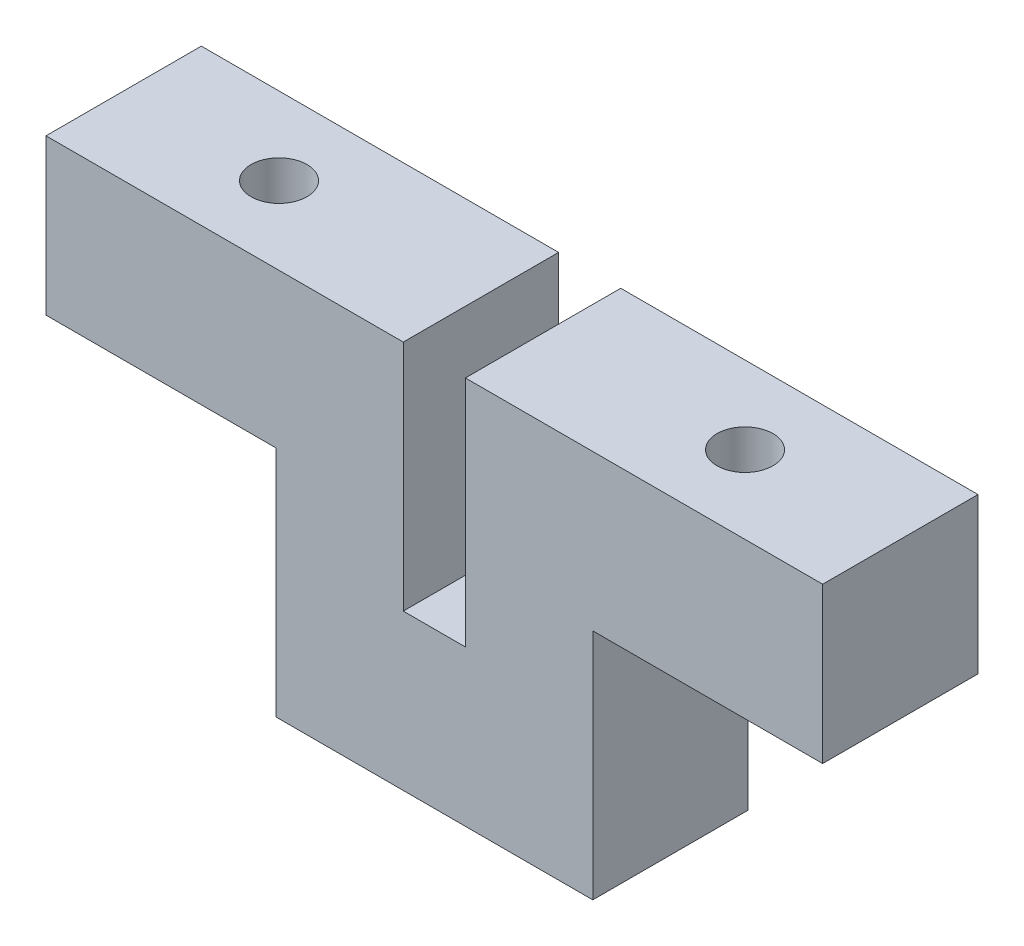
ISO-10303-21;
HEADER;
FILE_DESCRIPTION(('STEP AP214'),'2;1');
FILE_NAME('part.step','',(''),(''),'','','');
FILE_SCHEMA(('AUTOMOTIVE_DESIGN { 1 0 10303 214 1 1 1 1 }'));
ENDSEC;
DATA;
#1=APPLICATION_CONTEXT('core data for automotive mechanical design processes');
#2=APPLICATION_PROTOCOL_DEFINITION('international standard','automotive_design',2000,#1);
#3=PRODUCT_CONTEXT('',#1,'mechanical');
#4=PRODUCT('Part','Part','',(#3));
#5=PRODUCT_RELATED_PRODUCT_CATEGORY('part','',(#4));
#6=PRODUCT_DEFINITION_FORMATION('','',#4);
#7=PRODUCT_DEFINITION_CONTEXT('part definition',#1,'design');
#8=PRODUCT_DEFINITION('design','',#6,#7);
#9=PRODUCT_DEFINITION_SHAPE('','',#8);
#10=(LENGTH_UNIT() NAMED_UNIT(*) SI_UNIT(.MILLI.,.METRE.));
#11=(NAMED_UNIT(*) PLANE_ANGLE_UNIT() SI_UNIT($,.RADIAN.));
#12=(NAMED_UNIT(*) SI_UNIT($,.STERADIAN.) SOLID_ANGLE_UNIT());
#13=UNCERTAINTY_MEASURE_WITH_UNIT(LENGTH_MEASURE(1.E-05),#10,'distance_accuracy_value','');
#14=(GEOMETRIC_REPRESENTATION_CONTEXT(3) GLOBAL_UNCERTAINTY_ASSIGNED_CONTEXT((#13)) GLOBAL_UNIT_ASSIGNED_CONTEXT((#10,
#11,#12)) REPRESENTATION_CONTEXT('',''));
#15=CARTESIAN_POINT('',(0.,0.,0.));
#16=DIRECTION('',(0.,0.,1.));
#17=DIRECTION('',(1.,0.,0.));
#18=AXIS2_PLACEMENT_3D('',#15,#16,#17);
#19=CARTESIAN_POINT('',(0.,25.,10.));
#20=DIRECTION('',(0.,-1.,0.));
#21=DIRECTION('',(1.,0.,0.));
#22=AXIS2_PLACEMENT_3D('',#19,#20,#21);
#23=PLANE('',#22);
#24=CARTESIAN_POINT('',(10.,25.,5.));
#25=DIRECTION('',(0.,1.,0.));
#26=DIRECTION('',(-1.,0.,0.));
#27=AXIS2_PLACEMENT_3D('',#24,#25,#26);
#28=CIRCLE('',#27,1.8);
#29=CARTESIAN_POINT('',(8.2,25.,5.));
#30=VERTEX_POINT('',#29);
#31=EDGE_CURVE('E145',#30,#30,#28,.T.);
#32=ORIENTED_EDGE('',*,*,#31,.F.);
#33=EDGE_LOOP('',(#32));
#34=FACE_BOUND('',#33,.T.);
#35=DIRECTION('',(-1.,0.,0.));
#36=VECTOR('',#35,1.);
#37=CARTESIAN_POINT('',(0.,25.,10.));
#38=LINE('',#37,#36);
#39=CARTESIAN_POINT('',(23.,25.,10.));
#40=VERTEX_POINT('',#39);
#41=CARTESIAN_POINT('',(0.,25.,10.));
#42=VERTEX_POINT('',#41);
#43=EDGE_CURVE('E211',#40,#42,#38,.T.);
#44=ORIENTED_EDGE('',*,*,#43,.F.);
#45=DIRECTION('',(0.,0.,1.));
#46=VECTOR('',#45,1.);
#47=CARTESIAN_POINT('',(23.,25.,0.));
#48=LINE('',#47,#46);
#49=CARTESIAN_POINT('',(23.,25.,0.));
#50=VERTEX_POINT('',#49);
#51=EDGE_CURVE('E199',#50,#40,#48,.T.);
#52=ORIENTED_EDGE('',*,*,#51,.F.);
#53=DIRECTION('',(-1.,0.,0.));
#54=VECTOR('',#53,1.);
#55=CARTESIAN_POINT('',(0.,25.,0.));
#56=LINE('',#55,#54);
#57=CARTESIAN_POINT('',(0.,25.,0.));
#58=VERTEX_POINT('',#57);
#59=EDGE_CURVE('E147',#50,#58,#56,.T.);
#60=ORIENTED_EDGE('',*,*,#59,.T.);
#61=DIRECTION('',(0.,0.,-1.));
#62=VECTOR('',#61,1.);
#63=CARTESIAN_POINT('',(0.,25.,10.));
#64=LINE('',#63,#62);
#65=EDGE_CURVE('E42',#42,#58,#64,.T.);
#66=ORIENTED_EDGE('',*,*,#65,.F.);
#67=EDGE_LOOP('',(#44,#52,#60,#66));
#68=FACE_BOUND('',#67,.T.);
#69=ADVANCED_FACE('F33',(#34,#68),#23,.F.);
#70=CARTESIAN_POINT('',(50.,0.,10.));
#71=DIRECTION('',(0.,1.,0.));
#72=DIRECTION('',(-1.,0.,0.));
#73=AXIS2_PLACEMENT_3D('',#70,#71,#72);
#74=PLANE('',#73);
#75=DIRECTION('',(1.,0.,0.));
#76=VECTOR('',#75,1.);
#77=CARTESIAN_POINT('',(50.,0.,0.));
#78=LINE('',#77,#76);
#79=CARTESIAN_POINT('',(14.8,0.,0.));
#80=VERTEX_POINT('',#79);
#81=CARTESIAN_POINT('',(35.2,0.,0.));
#82=VERTEX_POINT('',#81);
#83=EDGE_CURVE('E138',#80,#82,#78,.T.);
#84=ORIENTED_EDGE('',*,*,#83,.T.);
#85=DIRECTION('',(0.,0.,1.));
#86=VECTOR('',#85,1.);
#87=CARTESIAN_POINT('',(35.2,0.,0.));
#88=LINE('',#87,#86);
#89=CARTESIAN_POINT('',(35.2,0.,10.));
#90=VERTEX_POINT('',#89);
#91=EDGE_CURVE('E122',#82,#90,#88,.T.);
#92=ORIENTED_EDGE('',*,*,#91,.T.);
#93=DIRECTION('',(1.,0.,0.));
#94=VECTOR('',#93,1.);
#95=CARTESIAN_POINT('',(50.,0.,10.));
#96=LINE('',#95,#94);
#97=CARTESIAN_POINT('',(14.8,0.,10.));
#98=VERTEX_POINT('',#97);
#99=EDGE_CURVE('E162',#98,#90,#96,.T.);
#100=ORIENTED_EDGE('',*,*,#99,.F.);
#101=DIRECTION('',(0.,0.,1.));
#102=VECTOR('',#101,1.);
#103=CARTESIAN_POINT('',(14.8,0.,0.));
#104=LINE('',#103,#102);
#105=EDGE_CURVE('E143',#80,#98,#104,.T.);
#106=ORIENTED_EDGE('',*,*,#105,.F.);
#107=EDGE_LOOP('',(#84,#92,#100,#106));
#108=FACE_BOUND('',#107,.T.);
#109=ADVANCED_FACE('F35',(#108),#74,.F.);
#110=CARTESIAN_POINT('',(50.,25.,10.));
#111=DIRECTION('',(-1.,0.,0.));
#112=DIRECTION('',(0.,0.,1.));
#113=AXIS2_PLACEMENT_3D('',#110,#111,#112);
#114=PLANE('',#113);
#115=DIRECTION('',(0.,1.,0.));
#116=VECTOR('',#115,1.);
#117=CARTESIAN_POINT('',(50.,25.,10.));
#118=LINE('',#117,#116);
#119=CARTESIAN_POINT('',(50.,15.,10.));
#120=VERTEX_POINT('',#119);
#121=CARTESIAN_POINT('',(50.,25.,10.));
#122=VERTEX_POINT('',#121);
#123=EDGE_CURVE('E210',#120,#122,#118,.T.);
#124=ORIENTED_EDGE('',*,*,#123,.F.);
#125=DIRECTION('',(0.,0.,1.));
#126=VECTOR('',#125,1.);
#127=CARTESIAN_POINT('',(50.,15.,0.));
#128=LINE('',#127,#126);
#129=CARTESIAN_POINT('',(50.,15.,0.));
#130=VERTEX_POINT('',#129);
#131=EDGE_CURVE('E130',#130,#120,#128,.T.);
#132=ORIENTED_EDGE('',*,*,#131,.F.);
#133=DIRECTION('',(0.,1.,0.));
#134=VECTOR('',#133,1.);
#135=CARTESIAN_POINT('',(50.,25.,0.));
#136=LINE('',#135,#134);
#137=CARTESIAN_POINT('',(50.,25.,0.));
#138=VERTEX_POINT('',#137);
#139=EDGE_CURVE('E144',#130,#138,#136,.T.);
#140=ORIENTED_EDGE('',*,*,#139,.T.);
#141=DIRECTION('',(0.,0.,-1.));
#142=VECTOR('',#141,1.);
#143=CARTESIAN_POINT('',(50.,25.,10.));
#144=LINE('',#143,#142);
#145=EDGE_CURVE('E11',#122,#138,#144,.T.);
#146=ORIENTED_EDGE('',*,*,#145,.F.);
#147=EDGE_LOOP('',(#124,#132,#140,#146));
#148=FACE_BOUND('',#147,.T.);
#149=ADVANCED_FACE('F236',(#148),#114,.F.);
#150=CARTESIAN_POINT('',(40.,25.,5.));
#151=DIRECTION('',(0.,1.,0.));
#152=DIRECTION('',(-1.,0.,0.));
#153=AXIS2_PLACEMENT_3D('',#150,#151,#152);
#154=CIRCLE('',#153,1.79999999999999);
#155=CARTESIAN_POINT('',(38.2,25.,5.));
#156=VERTEX_POINT('',#155);
#157=EDGE_CURVE('E150',#156,#156,#154,.T.);
#158=ORIENTED_EDGE('',*,*,#157,.F.);
#159=EDGE_LOOP('',(#158));
#160=FACE_BOUND('',#159,.T.);
#161=CARTESIAN_POINT('',(27.,25.,0.));
#162=VERTEX_POINT('',#161);
#163=EDGE_CURVE('E156',#138,#162,#56,.T.);
#164=ORIENTED_EDGE('',*,*,#163,.T.);
#165=DIRECTION('',(0.,0.,1.));
#166=VECTOR('',#165,1.);
#167=CARTESIAN_POINT('',(27.,25.,0.));
#168=LINE('',#167,#166);
#169=CARTESIAN_POINT('',(27.,25.,10.));
#170=VERTEX_POINT('',#169);
#171=EDGE_CURVE('E201',#162,#170,#168,.T.);
#172=ORIENTED_EDGE('',*,*,#171,.T.);
#173=EDGE_CURVE('E212',#122,#170,#38,.T.);
#174=ORIENTED_EDGE('',*,*,#173,.F.);
#175=ORIENTED_EDGE('',*,*,#145,.T.);
#176=EDGE_LOOP('',(#164,#172,#174,#175));
#177=FACE_BOUND('',#176,.T.);
#178=ADVANCED_FACE('F229',(#160,#177),#23,.F.);
#179=CARTESIAN_POINT('',(0.,0.,10.));
#180=DIRECTION('',(1.,0.,0.));
#181=DIRECTION('',(0.,1.,0.));
#182=AXIS2_PLACEMENT_3D('',#179,#180,#181);
#183=PLANE('',#182);
#184=DIRECTION('',(0.,-1.,0.));
#185=VECTOR('',#184,1.);
#186=CARTESIAN_POINT('',(0.,0.,0.));
#187=LINE('',#186,#185);
#188=CARTESIAN_POINT('',(0.,15.,0.));
#189=VERTEX_POINT('',#188);
#190=EDGE_CURVE('E159',#58,#189,#187,.T.);
#191=ORIENTED_EDGE('',*,*,#190,.T.);
#192=DIRECTION('',(0.,0.,1.));
#193=VECTOR('',#192,1.);
#194=CARTESIAN_POINT('',(0.,15.,0.));
#195=LINE('',#194,#193);
#196=CARTESIAN_POINT('',(0.,15.,10.));
#197=VERTEX_POINT('',#196);
#198=EDGE_CURVE('E167',#189,#197,#195,.T.);
#199=ORIENTED_EDGE('',*,*,#198,.T.);
#200=DIRECTION('',(0.,-1.,0.));
#201=VECTOR('',#200,1.);
#202=CARTESIAN_POINT('',(0.,0.,10.));
#203=LINE('',#202,#201);
#204=EDGE_CURVE('E153',#42,#197,#203,.T.);
#205=ORIENTED_EDGE('',*,*,#204,.F.);
#206=ORIENTED_EDGE('',*,*,#65,.T.);
#207=EDGE_LOOP('',(#191,#199,#205,#206));
#208=FACE_BOUND('',#207,.T.);
#209=ADVANCED_FACE('F227',(#208),#183,.F.);
#210=CARTESIAN_POINT('',(0.,0.,10.));
#211=DIRECTION('',(0.,0.,-1.));
#212=DIRECTION('',(-1.,0.,0.));
#213=AXIS2_PLACEMENT_3D('',#210,#211,#212);
#214=PLANE('',#213);
#215=ORIENTED_EDGE('',*,*,#99,.T.);
#216=DIRECTION('',(0.,-1.,0.));
#217=VECTOR('',#216,1.);
#218=CARTESIAN_POINT('',(35.2,0.,10.));
#219=LINE('',#218,#217);
#220=CARTESIAN_POINT('',(35.2,15.,10.));
#221=VERTEX_POINT('',#220);
#222=EDGE_CURVE('E125',#221,#90,#219,.T.);
#223=ORIENTED_EDGE('',*,*,#222,.F.);
#224=DIRECTION('',(-1.,0.,0.));
#225=VECTOR('',#224,1.);
#226=CARTESIAN_POINT('',(35.2,15.,10.));
#227=LINE('',#226,#225);
#228=EDGE_CURVE('E140',#120,#221,#227,.T.);
#229=ORIENTED_EDGE('',*,*,#228,.F.);
#230=ORIENTED_EDGE('',*,*,#123,.T.);
#231=ORIENTED_EDGE('',*,*,#173,.T.);
#232=DIRECTION('',(0.,1.,0.));
#233=VECTOR('',#232,1.);
#234=CARTESIAN_POINT('',(27.,25.,10.));
#235=LINE('',#234,#233);
#236=CARTESIAN_POINT('',(27.,10.,10.));
#237=VERTEX_POINT('',#236);
#238=EDGE_CURVE('E189',#237,#170,#235,.T.);
#239=ORIENTED_EDGE('',*,*,#238,.F.);
#240=DIRECTION('',(1.,0.,0.));
#241=VECTOR('',#240,1.);
#242=CARTESIAN_POINT('',(23.,10.,10.));
#243=LINE('',#242,#241);
#244=CARTESIAN_POINT('',(23.,10.,10.));
#245=VERTEX_POINT('',#244);
#246=EDGE_CURVE('E171',#245,#237,#243,.T.);
#247=ORIENTED_EDGE('',*,*,#246,.F.);
#248=DIRECTION('',(0.,-1.,0.));
#249=VECTOR('',#248,1.);
#250=CARTESIAN_POINT('',(23.,25.,10.));
#251=LINE('',#250,#249);
#252=EDGE_CURVE('E166',#40,#245,#251,.T.);
#253=ORIENTED_EDGE('',*,*,#252,.F.);
#254=ORIENTED_EDGE('',*,*,#43,.T.);
#255=ORIENTED_EDGE('',*,*,#204,.T.);
#256=DIRECTION('',(-1.,0.,0.));
#257=VECTOR('',#256,1.);
#258=CARTESIAN_POINT('',(0.,15.,10.));
#259=LINE('',#258,#257);
#260=CARTESIAN_POINT('',(14.8,15.,10.));
#261=VERTEX_POINT('',#260);
#262=EDGE_CURVE('E181',#261,#197,#259,.T.);
#263=ORIENTED_EDGE('',*,*,#262,.F.);
#264=DIRECTION('',(0.,1.,0.));
#265=VECTOR('',#264,1.);
#266=CARTESIAN_POINT('',(14.8,0.,10.));
#267=LINE('',#266,#265);
#268=EDGE_CURVE('E265',#98,#261,#267,.T.);
#269=ORIENTED_EDGE('',*,*,#268,.F.);
#270=EDGE_LOOP('',(#215,#223,#229,#230,#231,#239,#247,#253,#254,#255,#263,#269));
#271=FACE_BOUND('',#270,.T.);
#272=ADVANCED_FACE('F220',(#271),#214,.F.);
#273=CARTESIAN_POINT('',(0.,0.,0.));
#274=DIRECTION('',(0.,0.,-1.));
#275=DIRECTION('',(-1.,0.,0.));
#276=AXIS2_PLACEMENT_3D('',#273,#274,#275);
#277=PLANE('',#276);
#278=DIRECTION('',(0.,-1.,0.));
#279=VECTOR('',#278,1.);
#280=CARTESIAN_POINT('',(35.2,0.,0.));
#281=LINE('',#280,#279);
#282=CARTESIAN_POINT('',(35.2,15.,0.));
#283=VERTEX_POINT('',#282);
#284=EDGE_CURVE('E50',#283,#82,#281,.T.);
#285=ORIENTED_EDGE('',*,*,#284,.T.);
#286=ORIENTED_EDGE('',*,*,#83,.F.);
#287=DIRECTION('',(0.,1.,0.));
#288=VECTOR('',#287,1.);
#289=CARTESIAN_POINT('',(14.8,0.,0.));
#290=LINE('',#289,#288);
#291=CARTESIAN_POINT('',(14.8,15.,0.));
#292=VERTEX_POINT('',#291);
#293=EDGE_CURVE('E263',#80,#292,#290,.T.);
#294=ORIENTED_EDGE('',*,*,#293,.T.);
#295=DIRECTION('',(-1.,0.,0.));
#296=VECTOR('',#295,1.);
#297=CARTESIAN_POINT('',(0.,15.,0.));
#298=LINE('',#297,#296);
#299=EDGE_CURVE('E58',#292,#189,#298,.T.);
#300=ORIENTED_EDGE('',*,*,#299,.T.);
#301=ORIENTED_EDGE('',*,*,#190,.F.);
#302=ORIENTED_EDGE('',*,*,#59,.F.);
#303=DIRECTION('',(0.,-1.,0.));
#304=VECTOR('',#303,1.);
#305=CARTESIAN_POINT('',(23.,25.,0.));
#306=LINE('',#305,#304);
#307=CARTESIAN_POINT('',(23.,10.,0.));
#308=VERTEX_POINT('',#307);
#309=EDGE_CURVE('E185',#50,#308,#306,.T.);
#310=ORIENTED_EDGE('',*,*,#309,.T.);
#311=DIRECTION('',(1.,0.,0.));
#312=VECTOR('',#311,1.);
#313=CARTESIAN_POINT('',(23.,10.,0.));
#314=LINE('',#313,#312);
#315=CARTESIAN_POINT('',(27.,10.,0.));
#316=VERTEX_POINT('',#315);
#317=EDGE_CURVE('E188',#308,#316,#314,.T.);
#318=ORIENTED_EDGE('',*,*,#317,.T.);
#319=DIRECTION('',(0.,1.,0.));
#320=VECTOR('',#319,1.);
#321=CARTESIAN_POINT('',(27.,25.,0.));
#322=LINE('',#321,#320);
#323=EDGE_CURVE('E192',#316,#162,#322,.T.);
#324=ORIENTED_EDGE('',*,*,#323,.T.);
#325=ORIENTED_EDGE('',*,*,#163,.F.);
#326=ORIENTED_EDGE('',*,*,#139,.F.);
#327=DIRECTION('',(-1.,0.,0.));
#328=VECTOR('',#327,1.);
#329=CARTESIAN_POINT('',(35.2,15.,0.));
#330=LINE('',#329,#328);
#331=EDGE_CURVE('E131',#130,#283,#330,.T.);
#332=ORIENTED_EDGE('',*,*,#331,.T.);
#333=EDGE_LOOP('',(#285,#286,#294,#300,#301,#302,#310,#318,#324,#325,#326,#332));
#334=FACE_BOUND('',#333,.T.);
#335=ADVANCED_FACE('F136',(#334),#277,.T.);
#336=CARTESIAN_POINT('',(10.,0.,5.));
#337=DIRECTION('',(0.,1.,0.));
#338=DIRECTION('',(-1.,0.,0.));
#339=AXIS2_PLACEMENT_3D('',#336,#337,#338);
#340=CYLINDRICAL_SURFACE('',#339,1.8);
#341=CARTESIAN_POINT('',(10.,15.,5.));
#342=DIRECTION('',(0.,1.,0.));
#343=DIRECTION('',(0.,0.,1.));
#344=AXIS2_PLACEMENT_3D('',#341,#342,#343);
#345=CIRCLE('',#344,1.8);
#346=CARTESIAN_POINT('',(10.,15.,6.8));
#347=VERTEX_POINT('',#346);
#348=EDGE_CURVE('E164',#347,#347,#345,.F.);
#349=ORIENTED_EDGE('',*,*,#348,.T.);
#350=EDGE_LOOP('',(#349));
#351=FACE_BOUND('',#350,.T.);
#352=ORIENTED_EDGE('',*,*,#31,.T.);
#353=EDGE_LOOP('',(#352));
#354=FACE_BOUND('',#353,.T.);
#355=ADVANCED_FACE('F303',(#351,#354),#340,.F.);
#356=CARTESIAN_POINT('',(40.,0.,5.));
#357=DIRECTION('',(0.,1.,0.));
#358=DIRECTION('',(-1.,0.,0.));
#359=AXIS2_PLACEMENT_3D('',#356,#357,#358);
#360=CYLINDRICAL_SURFACE('',#359,1.79999999999999);
#361=CARTESIAN_POINT('',(40.,15.,5.));
#362=DIRECTION('',(0.,1.,0.));
#363=DIRECTION('',(0.,0.,1.));
#364=AXIS2_PLACEMENT_3D('',#361,#362,#363);
#365=CIRCLE('',#364,1.79999999999999);
#366=CARTESIAN_POINT('',(40.,15.,6.8));
#367=VERTEX_POINT('',#366);
#368=EDGE_CURVE('E37',#367,#367,#365,.F.);
#369=ORIENTED_EDGE('',*,*,#368,.T.);
#370=EDGE_LOOP('',(#369));
#371=FACE_BOUND('',#370,.T.);
#372=ORIENTED_EDGE('',*,*,#157,.T.);
#373=EDGE_LOOP('',(#372));
#374=FACE_BOUND('',#373,.T.);
#375=ADVANCED_FACE('F272',(#371,#374),#360,.F.);
#376=CARTESIAN_POINT('',(23.,25.,0.));
#377=DIRECTION('',(-1.,0.,0.));
#378=DIRECTION('',(0.,-1.,0.));
#379=AXIS2_PLACEMENT_3D('',#376,#377,#378);
#380=PLANE('',#379);
#381=ORIENTED_EDGE('',*,*,#252,.T.);
#382=DIRECTION('',(0.,0.,1.));
#383=VECTOR('',#382,1.);
#384=CARTESIAN_POINT('',(23.,10.,0.));
#385=LINE('',#384,#383);
#386=EDGE_CURVE('E194',#308,#245,#385,.T.);
#387=ORIENTED_EDGE('',*,*,#386,.F.);
#388=ORIENTED_EDGE('',*,*,#309,.F.);
#389=ORIENTED_EDGE('',*,*,#51,.T.);
#390=EDGE_LOOP('',(#381,#387,#388,#389));
#391=FACE_BOUND('',#390,.T.);
#392=ADVANCED_FACE('F293',(#391),#380,.F.);
#393=CARTESIAN_POINT('',(27.,25.,0.));
#394=DIRECTION('',(1.,0.,0.));
#395=DIRECTION('',(0.,1.,0.));
#396=AXIS2_PLACEMENT_3D('',#393,#394,#395);
#397=PLANE('',#396);
#398=ORIENTED_EDGE('',*,*,#238,.T.);
#399=ORIENTED_EDGE('',*,*,#171,.F.);
#400=ORIENTED_EDGE('',*,*,#323,.F.);
#401=DIRECTION('',(0.,0.,1.));
#402=VECTOR('',#401,1.);
#403=CARTESIAN_POINT('',(27.,10.,0.));
#404=LINE('',#403,#402);
#405=EDGE_CURVE('E204',#316,#237,#404,.T.);
#406=ORIENTED_EDGE('',*,*,#405,.T.);
#407=EDGE_LOOP('',(#398,#399,#400,#406));
#408=FACE_BOUND('',#407,.T.);
#409=ADVANCED_FACE('F290',(#408),#397,.F.);
#410=CARTESIAN_POINT('',(23.,10.,0.));
#411=DIRECTION('',(0.,-1.,0.));
#412=DIRECTION('',(0.,0.,-1.));
#413=AXIS2_PLACEMENT_3D('',#410,#411,#412);
#414=PLANE('',#413);
#415=ORIENTED_EDGE('',*,*,#246,.T.);
#416=ORIENTED_EDGE('',*,*,#405,.F.);
#417=ORIENTED_EDGE('',*,*,#317,.F.);
#418=ORIENTED_EDGE('',*,*,#386,.T.);
#419=EDGE_LOOP('',(#415,#416,#417,#418));
#420=FACE_BOUND('',#419,.T.);
#421=ADVANCED_FACE('F288',(#420),#414,.F.);
#422=CARTESIAN_POINT('',(0.,15.,0.));
#423=DIRECTION('',(0.,1.,0.));
#424=DIRECTION('',(0.,0.,1.));
#425=AXIS2_PLACEMENT_3D('',#422,#423,#424);
#426=PLANE('',#425);
#427=ORIENTED_EDGE('',*,*,#262,.T.);
#428=ORIENTED_EDGE('',*,*,#198,.F.);
#429=ORIENTED_EDGE('',*,*,#299,.F.);
#430=DIRECTION('',(0.,0.,1.));
#431=VECTOR('',#430,1.);
#432=CARTESIAN_POINT('',(14.8,15.,0.));
#433=LINE('',#432,#431);
#434=EDGE_CURVE('E174',#292,#261,#433,.T.);
#435=ORIENTED_EDGE('',*,*,#434,.T.);
#436=EDGE_LOOP('',(#427,#428,#429,#435));
#437=FACE_BOUND('',#436,.T.);
#438=ORIENTED_EDGE('',*,*,#348,.F.);
#439=EDGE_LOOP('',(#438));
#440=FACE_BOUND('',#439,.T.);
#441=ADVANCED_FACE('F284',(#437,#440),#426,.F.);
#442=CARTESIAN_POINT('',(14.8,0.,0.));
#443=DIRECTION('',(1.,0.,0.));
#444=DIRECTION('',(0.,0.,-1.));
#445=AXIS2_PLACEMENT_3D('',#442,#443,#444);
#446=PLANE('',#445);
#447=ORIENTED_EDGE('',*,*,#268,.T.);
#448=ORIENTED_EDGE('',*,*,#434,.F.);
#449=ORIENTED_EDGE('',*,*,#293,.F.);
#450=ORIENTED_EDGE('',*,*,#105,.T.);
#451=EDGE_LOOP('',(#447,#448,#449,#450));
#452=FACE_BOUND('',#451,.T.);
#453=ADVANCED_FACE('F277',(#452),#446,.F.);
#454=CARTESIAN_POINT('',(35.2,15.,0.));
#455=DIRECTION('',(0.,1.,0.));
#456=DIRECTION('',(0.,0.,1.));
#457=AXIS2_PLACEMENT_3D('',#454,#455,#456);
#458=PLANE('',#457);
#459=ORIENTED_EDGE('',*,*,#228,.T.);
#460=DIRECTION('',(0.,0.,1.));
#461=VECTOR('',#460,1.);
#462=CARTESIAN_POINT('',(35.2,15.,0.));
#463=LINE('',#462,#461);
#464=EDGE_CURVE('E260',#283,#221,#463,.T.);
#465=ORIENTED_EDGE('',*,*,#464,.F.);
#466=ORIENTED_EDGE('',*,*,#331,.F.);
#467=ORIENTED_EDGE('',*,*,#131,.T.);
#468=EDGE_LOOP('',(#459,#465,#466,#467));
#469=FACE_BOUND('',#468,.T.);
#470=ORIENTED_EDGE('',*,*,#368,.F.);
#471=EDGE_LOOP('',(#470));
#472=FACE_BOUND('',#471,.T.);
#473=ADVANCED_FACE('F275',(#469,#472),#458,.F.);
#474=CARTESIAN_POINT('',(35.2,0.,0.));
#475=DIRECTION('',(-1.,0.,0.));
#476=DIRECTION('',(0.,0.,1.));
#477=AXIS2_PLACEMENT_3D('',#474,#475,#476);
#478=PLANE('',#477);
#479=ORIENTED_EDGE('',*,*,#222,.T.);
#480=ORIENTED_EDGE('',*,*,#91,.F.);
#481=ORIENTED_EDGE('',*,*,#284,.F.);
#482=ORIENTED_EDGE('',*,*,#464,.T.);
#483=EDGE_LOOP('',(#479,#480,#481,#482));
#484=FACE_BOUND('',#483,.T.);
#485=ADVANCED_FACE('F123',(#484),#478,.F.);
#486=CLOSED_SHELL('',(#69,#109,#149,#178,#209,#272,#335,#355,#375,#392,#409,#421,#441,#453,#473,#485));
#487=MANIFOLD_SOLID_BREP('B2',#486);
#488=ADVANCED_BREP_SHAPE_REPRESENTATION('',(#18,#487),#14);
#489=SHAPE_DEFINITION_REPRESENTATION(#9,#488);
ENDSEC;
END-ISO-10303-21;
